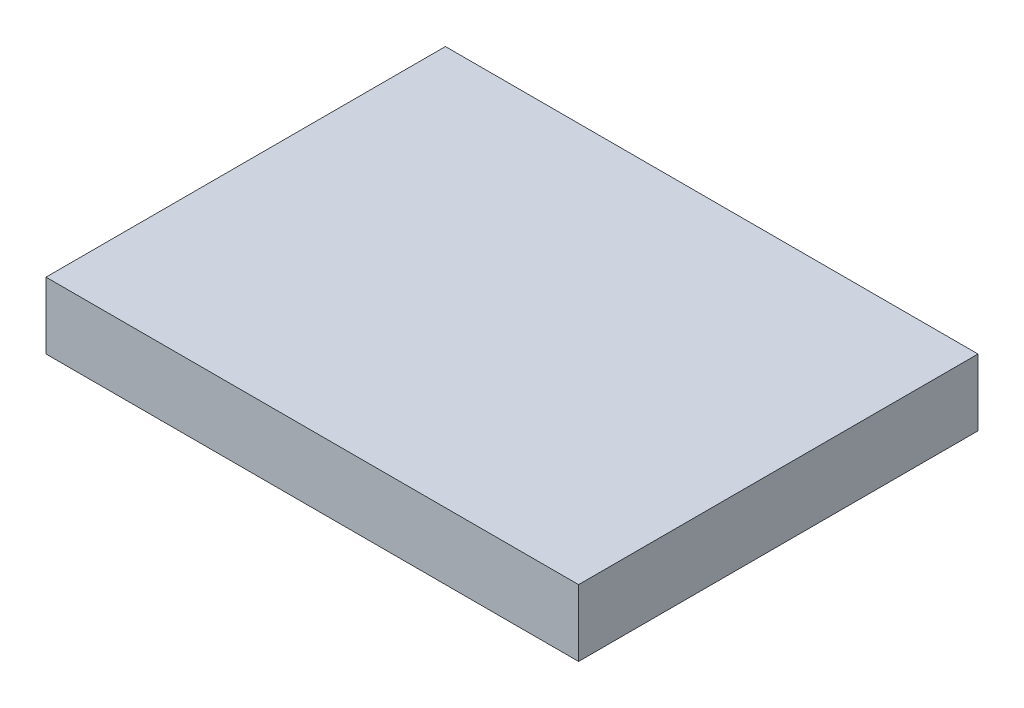
ISO-10303-21;
HEADER;
FILE_DESCRIPTION(('STEP AP214'),'2;1');
FILE_NAME('part.step','',(''),(''),'','','');
FILE_SCHEMA(('AUTOMOTIVE_DESIGN { 1 0 10303 214 1 1 1 1 }'));
ENDSEC;
DATA;
#1=APPLICATION_CONTEXT('core data for automotive mechanical design processes');
#2=APPLICATION_PROTOCOL_DEFINITION('international standard','automotive_design',2000,#1);
#3=PRODUCT_CONTEXT('',#1,'mechanical');
#4=PRODUCT('Part','Part','',(#3));
#5=PRODUCT_RELATED_PRODUCT_CATEGORY('part','',(#4));
#6=PRODUCT_DEFINITION_FORMATION('','',#4);
#7=PRODUCT_DEFINITION_CONTEXT('part definition',#1,'design');
#8=PRODUCT_DEFINITION('design','',#6,#7);
#9=PRODUCT_DEFINITION_SHAPE('','',#8);
#10=(LENGTH_UNIT() NAMED_UNIT(*) SI_UNIT(.MILLI.,.METRE.));
#11=(NAMED_UNIT(*) PLANE_ANGLE_UNIT() SI_UNIT($,.RADIAN.));
#12=(NAMED_UNIT(*) SI_UNIT($,.STERADIAN.) SOLID_ANGLE_UNIT());
#13=UNCERTAINTY_MEASURE_WITH_UNIT(LENGTH_MEASURE(1.E-05),#10,'distance_accuracy_value','');
#14=(GEOMETRIC_REPRESENTATION_CONTEXT(3) GLOBAL_UNCERTAINTY_ASSIGNED_CONTEXT((#13)) GLOBAL_UNIT_ASSIGNED_CONTEXT((#10,
#11,#12)) REPRESENTATION_CONTEXT('',''));
#15=CARTESIAN_POINT('',(0.,0.,0.));
#16=DIRECTION('',(0.,0.,1.));
#17=DIRECTION('',(1.,0.,0.));
#18=AXIS2_PLACEMENT_3D('',#15,#16,#17);
#19=CARTESIAN_POINT('',(0.,-12.7,0.));
#20=DIRECTION('',(-1.,0.,0.));
#21=DIRECTION('',(0.,0.,1.));
#22=AXIS2_PLACEMENT_3D('',#19,#20,#21);
#23=PLANE('',#22);
#24=DIRECTION('',(0.,0.,1.));
#25=VECTOR('',#24,1.);
#26=CARTESIAN_POINT('',(0.,0.,0.));
#27=LINE('',#26,#25);
#28=CARTESIAN_POINT('',(0.,0.,-76.2));
#29=VERTEX_POINT('',#28);
#30=CARTESIAN_POINT('',(0.,0.,0.));
#31=VERTEX_POINT('',#30);
#32=EDGE_CURVE('E95',#29,#31,#27,.T.);
#33=ORIENTED_EDGE('',*,*,#32,.F.);
#34=DIRECTION('',(0.,1.,0.));
#35=VECTOR('',#34,1.);
#36=CARTESIAN_POINT('',(0.,-12.7,-76.2));
#37=LINE('',#36,#35);
#38=CARTESIAN_POINT('',(0.,-12.7,-76.2));
#39=VERTEX_POINT('',#38);
#40=EDGE_CURVE('E11',#39,#29,#37,.T.);
#41=ORIENTED_EDGE('',*,*,#40,.F.);
#42=DIRECTION('',(0.,0.,1.));
#43=VECTOR('',#42,1.);
#44=CARTESIAN_POINT('',(0.,-12.7,0.));
#45=LINE('',#44,#43);
#46=CARTESIAN_POINT('',(0.,-12.7,0.));
#47=VERTEX_POINT('',#46);
#48=EDGE_CURVE('E89',#39,#47,#45,.T.);
#49=ORIENTED_EDGE('',*,*,#48,.T.);
#50=DIRECTION('',(0.,1.,0.));
#51=VECTOR('',#50,1.);
#52=CARTESIAN_POINT('',(0.,-12.7,0.));
#53=LINE('',#52,#51);
#54=EDGE_CURVE('E34',#47,#31,#53,.T.);
#55=ORIENTED_EDGE('',*,*,#54,.T.);
#56=EDGE_LOOP('',(#33,#41,#49,#55));
#57=FACE_BOUND('',#56,.T.);
#58=ADVANCED_FACE('F31',(#57),#23,.T.);
#59=CARTESIAN_POINT('',(0.,-12.7,-76.2));
#60=DIRECTION('',(0.,0.,-1.));
#61=DIRECTION('',(-1.,0.,0.));
#62=AXIS2_PLACEMENT_3D('',#59,#60,#61);
#63=PLANE('',#62);
#64=DIRECTION('',(-1.,0.,0.));
#65=VECTOR('',#64,1.);
#66=CARTESIAN_POINT('',(0.,0.,-76.2));
#67=LINE('',#66,#65);
#68=CARTESIAN_POINT('',(101.6,0.,-76.2));
#69=VERTEX_POINT('',#68);
#70=EDGE_CURVE('E91',#69,#29,#67,.T.);
#71=ORIENTED_EDGE('',*,*,#70,.F.);
#72=DIRECTION('',(0.,1.,0.));
#73=VECTOR('',#72,1.);
#74=CARTESIAN_POINT('',(101.6,-12.7,-76.2));
#75=LINE('',#74,#73);
#76=CARTESIAN_POINT('',(101.6,-12.7,-76.2));
#77=VERTEX_POINT('',#76);
#78=EDGE_CURVE('E40',#77,#69,#75,.T.);
#79=ORIENTED_EDGE('',*,*,#78,.F.);
#80=DIRECTION('',(-1.,0.,0.));
#81=VECTOR('',#80,1.);
#82=CARTESIAN_POINT('',(0.,-12.7,-76.2));
#83=LINE('',#82,#81);
#84=EDGE_CURVE('E86',#77,#39,#83,.T.);
#85=ORIENTED_EDGE('',*,*,#84,.T.);
#86=ORIENTED_EDGE('',*,*,#40,.T.);
#87=EDGE_LOOP('',(#71,#79,#85,#86));
#88=FACE_BOUND('',#87,.T.);
#89=ADVANCED_FACE('F105',(#88),#63,.T.);
#90=CARTESIAN_POINT('',(101.6,-12.7,0.));
#91=DIRECTION('',(1.,0.,0.));
#92=DIRECTION('',(0.,0.,-1.));
#93=AXIS2_PLACEMENT_3D('',#90,#91,#92);
#94=PLANE('',#93);
#95=DIRECTION('',(0.,0.,-1.));
#96=VECTOR('',#95,1.);
#97=CARTESIAN_POINT('',(101.6,0.,0.));
#98=LINE('',#97,#96);
#99=CARTESIAN_POINT('',(101.6,0.,0.));
#100=VERTEX_POINT('',#99);
#101=EDGE_CURVE('E81',#100,#69,#98,.T.);
#102=ORIENTED_EDGE('',*,*,#101,.F.);
#103=DIRECTION('',(0.,1.,0.));
#104=VECTOR('',#103,1.);
#105=CARTESIAN_POINT('',(101.6,-12.7,0.));
#106=LINE('',#105,#104);
#107=CARTESIAN_POINT('',(101.6,-12.7,0.));
#108=VERTEX_POINT('',#107);
#109=EDGE_CURVE('E76',#108,#100,#106,.T.);
#110=ORIENTED_EDGE('',*,*,#109,.F.);
#111=DIRECTION('',(0.,0.,-1.));
#112=VECTOR('',#111,1.);
#113=CARTESIAN_POINT('',(101.6,-12.7,0.));
#114=LINE('',#113,#112);
#115=EDGE_CURVE('E79',#108,#77,#114,.T.);
#116=ORIENTED_EDGE('',*,*,#115,.T.);
#117=ORIENTED_EDGE('',*,*,#78,.T.);
#118=EDGE_LOOP('',(#102,#110,#116,#117));
#119=FACE_BOUND('',#118,.T.);
#120=ADVANCED_FACE('F78',(#119),#94,.T.);
#121=CARTESIAN_POINT('',(0.,-12.7,0.));
#122=DIRECTION('',(0.,0.,1.));
#123=DIRECTION('',(1.,0.,0.));
#124=AXIS2_PLACEMENT_3D('',#121,#122,#123);
#125=PLANE('',#124);
#126=DIRECTION('',(1.,0.,0.));
#127=VECTOR('',#126,1.);
#128=CARTESIAN_POINT('',(0.,0.,0.));
#129=LINE('',#128,#127);
#130=EDGE_CURVE('E98',#31,#100,#129,.T.);
#131=ORIENTED_EDGE('',*,*,#130,.F.);
#132=ORIENTED_EDGE('',*,*,#54,.F.);
#133=DIRECTION('',(1.,0.,0.));
#134=VECTOR('',#133,1.);
#135=CARTESIAN_POINT('',(0.,-12.7,0.));
#136=LINE('',#135,#134);
#137=EDGE_CURVE('E85',#47,#108,#136,.T.);
#138=ORIENTED_EDGE('',*,*,#137,.T.);
#139=ORIENTED_EDGE('',*,*,#109,.T.);
#140=EDGE_LOOP('',(#131,#132,#138,#139));
#141=FACE_BOUND('',#140,.T.);
#142=ADVANCED_FACE('F88',(#141),#125,.T.);
#143=CARTESIAN_POINT('',(0.,-12.7,-76.2));
#144=DIRECTION('',(0.,-1.,0.));
#145=DIRECTION('',(0.,0.,-1.));
#146=AXIS2_PLACEMENT_3D('',#143,#144,#145);
#147=PLANE('',#146);
#148=ORIENTED_EDGE('',*,*,#48,.F.);
#149=ORIENTED_EDGE('',*,*,#84,.F.);
#150=ORIENTED_EDGE('',*,*,#115,.F.);
#151=ORIENTED_EDGE('',*,*,#137,.F.);
#152=EDGE_LOOP('',(#148,#149,#150,#151));
#153=FACE_BOUND('',#152,.T.);
#154=ADVANCED_FACE('F84',(#153),#147,.T.);
#155=CARTESIAN_POINT('',(0.,0.,-76.2));
#156=DIRECTION('',(0.,-1.,0.));
#157=DIRECTION('',(0.,0.,-1.));
#158=AXIS2_PLACEMENT_3D('',#155,#156,#157);
#159=PLANE('',#158);
#160=ORIENTED_EDGE('',*,*,#32,.T.);
#161=ORIENTED_EDGE('',*,*,#130,.T.);
#162=ORIENTED_EDGE('',*,*,#101,.T.);
#163=ORIENTED_EDGE('',*,*,#70,.T.);
#164=EDGE_LOOP('',(#160,#161,#162,#163));
#165=FACE_BOUND('',#164,.T.);
#166=ADVANCED_FACE('F104',(#165),#159,.F.);
#167=CLOSED_SHELL('',(#58,#89,#120,#142,#154,#166));
#168=MANIFOLD_SOLID_BREP('B2',#167);
#169=ADVANCED_BREP_SHAPE_REPRESENTATION('',(#18,#168),#14);
#170=SHAPE_DEFINITION_REPRESENTATION(#9,#169);
ENDSEC;
END-ISO-10303-21;
